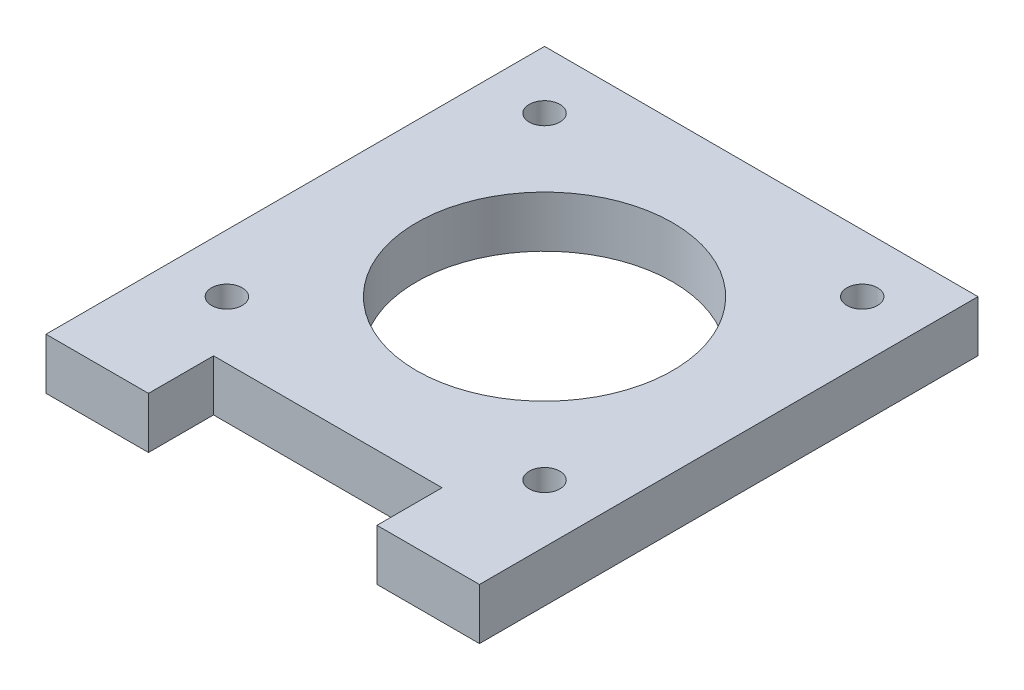
ISO-10303-21;
HEADER;
FILE_DESCRIPTION(('STEP AP214'),'2;1');
FILE_NAME('part.step','',(''),(''),'','','');
FILE_SCHEMA(('AUTOMOTIVE_DESIGN { 1 0 10303 214 1 1 1 1 }'));
ENDSEC;
DATA;
#1=APPLICATION_CONTEXT('core data for automotive mechanical design processes');
#2=APPLICATION_PROTOCOL_DEFINITION('international standard','automotive_design',2000,#1);
#3=PRODUCT_CONTEXT('',#1,'mechanical');
#4=PRODUCT('Part','Part','',(#3));
#5=PRODUCT_RELATED_PRODUCT_CATEGORY('part','',(#4));
#6=PRODUCT_DEFINITION_FORMATION('','',#4);
#7=PRODUCT_DEFINITION_CONTEXT('part definition',#1,'design');
#8=PRODUCT_DEFINITION('design','',#6,#7);
#9=PRODUCT_DEFINITION_SHAPE('','',#8);
#10=(LENGTH_UNIT() NAMED_UNIT(*) SI_UNIT(.MILLI.,.METRE.));
#11=(NAMED_UNIT(*) PLANE_ANGLE_UNIT() SI_UNIT($,.RADIAN.));
#12=(NAMED_UNIT(*) SI_UNIT($,.STERADIAN.) SOLID_ANGLE_UNIT());
#13=UNCERTAINTY_MEASURE_WITH_UNIT(LENGTH_MEASURE(1.E-05),#10,'distance_accuracy_value','');
#14=(GEOMETRIC_REPRESENTATION_CONTEXT(3) GLOBAL_UNCERTAINTY_ASSIGNED_CONTEXT((#13)) GLOBAL_UNIT_ASSIGNED_CONTEXT((#10,
#11,#12)) REPRESENTATION_CONTEXT('',''));
#15=CARTESIAN_POINT('',(0.,0.,0.));
#16=DIRECTION('',(0.,0.,1.));
#17=DIRECTION('',(1.,0.,0.));
#18=AXIS2_PLACEMENT_3D('',#15,#16,#17);
#19=CARTESIAN_POINT('',(0.,2.5,0.));
#20=DIRECTION('',(0.,-1.,0.));
#21=DIRECTION('',(0.,0.,-1.));
#22=AXIS2_PLACEMENT_3D('',#19,#20,#21);
#23=PLANE('',#22);
#24=DIRECTION('',(0.,0.,-1.));
#25=VECTOR('',#24,1.);
#26=CARTESIAN_POINT('',(21.15,2.5,21.15));
#27=LINE('',#26,#25);
#28=CARTESIAN_POINT('',(21.15,2.5,27.5));
#29=VERTEX_POINT('',#28);
#30=CARTESIAN_POINT('',(21.15,2.5,-21.15));
#31=VERTEX_POINT('',#30);
#32=EDGE_CURVE('E50',#29,#31,#27,.T.);
#33=ORIENTED_EDGE('',*,*,#32,.T.);
#34=DIRECTION('',(-1.,0.,0.));
#35=VECTOR('',#34,1.);
#36=CARTESIAN_POINT('',(-21.15,2.5,-21.15));
#37=LINE('',#36,#35);
#38=CARTESIAN_POINT('',(-21.15,2.5,-21.15));
#39=VERTEX_POINT('',#38);
#40=EDGE_CURVE('E94',#31,#39,#37,.T.);
#41=ORIENTED_EDGE('',*,*,#40,.T.);
#42=DIRECTION('',(0.,0.,1.));
#43=VECTOR('',#42,1.);
#44=CARTESIAN_POINT('',(-21.15,2.5,21.15));
#45=LINE('',#44,#43);
#46=CARTESIAN_POINT('',(-21.15,2.5,27.5));
#47=VERTEX_POINT('',#46);
#48=EDGE_CURVE('E162',#39,#47,#45,.T.);
#49=ORIENTED_EDGE('',*,*,#48,.T.);
#50=DIRECTION('',(1.,0.,0.));
#51=VECTOR('',#50,1.);
#52=CARTESIAN_POINT('',(-21.15,2.5,27.5));
#53=LINE('',#52,#51);
#54=CARTESIAN_POINT('',(-11.15,2.5,27.5));
#55=VERTEX_POINT('',#54);
#56=EDGE_CURVE('E176',#47,#55,#53,.T.);
#57=ORIENTED_EDGE('',*,*,#56,.T.);
#58=DIRECTION('',(0.,0.,-1.));
#59=VECTOR('',#58,1.);
#60=CARTESIAN_POINT('',(-11.15,2.5,27.5));
#61=LINE('',#60,#59);
#62=CARTESIAN_POINT('',(-11.15,2.5,21.15));
#63=VERTEX_POINT('',#62);
#64=EDGE_CURVE('E114',#55,#63,#61,.T.);
#65=ORIENTED_EDGE('',*,*,#64,.T.);
#66=DIRECTION('',(1.,0.,0.));
#67=VECTOR('',#66,1.);
#68=CARTESIAN_POINT('',(-11.15,2.5,21.15));
#69=LINE('',#68,#67);
#70=CARTESIAN_POINT('',(11.15,2.5,21.15));
#71=VERTEX_POINT('',#70);
#72=EDGE_CURVE('E108',#63,#71,#69,.T.);
#73=ORIENTED_EDGE('',*,*,#72,.T.);
#74=DIRECTION('',(0.,0.,1.));
#75=VECTOR('',#74,1.);
#76=CARTESIAN_POINT('',(11.15,2.5,21.15));
#77=LINE('',#76,#75);
#78=CARTESIAN_POINT('',(11.15,2.5,27.5));
#79=VERTEX_POINT('',#78);
#80=EDGE_CURVE('E112',#71,#79,#77,.T.);
#81=ORIENTED_EDGE('',*,*,#80,.T.);
#82=DIRECTION('',(1.,0.,0.));
#83=VECTOR('',#82,1.);
#84=CARTESIAN_POINT('',(11.15,2.5,27.5));
#85=LINE('',#84,#83);
#86=EDGE_CURVE('E128',#79,#29,#85,.T.);
#87=ORIENTED_EDGE('',*,*,#86,.T.);
#88=EDGE_LOOP('',(#33,#41,#49,#57,#65,#73,#81,#87));
#89=FACE_BOUND('',#88,.T.);
#90=CARTESIAN_POINT('',(0.,2.5,0.));
#91=DIRECTION('',(0.,1.,0.));
#92=DIRECTION('',(0.,0.,1.));
#93=AXIS2_PLACEMENT_3D('',#90,#91,#92);
#94=CIRCLE('',#93,12.5);
#95=CARTESIAN_POINT('',(0.,2.5,12.5));
#96=VERTEX_POINT('',#95);
#97=EDGE_CURVE('E138',#96,#96,#94,.T.);
#98=ORIENTED_EDGE('',*,*,#97,.F.);
#99=EDGE_LOOP('',(#98));
#100=FACE_BOUND('',#99,.T.);
#101=CARTESIAN_POINT('',(-15.5,2.5,-15.5));
#102=DIRECTION('',(0.,1.,0.));
#103=DIRECTION('',(0.,0.,1.));
#104=AXIS2_PLACEMENT_3D('',#101,#102,#103);
#105=CIRCLE('',#104,1.5);
#106=CARTESIAN_POINT('',(-15.5,2.5,-14.));
#107=VERTEX_POINT('',#106);
#108=EDGE_CURVE('E185',#107,#107,#105,.T.);
#109=ORIENTED_EDGE('',*,*,#108,.F.);
#110=EDGE_LOOP('',(#109));
#111=FACE_BOUND('',#110,.T.);
#112=CARTESIAN_POINT('',(15.5,2.5,-15.5));
#113=DIRECTION('',(0.,1.,0.));
#114=DIRECTION('',(0.,0.,1.));
#115=AXIS2_PLACEMENT_3D('',#112,#113,#114);
#116=CIRCLE('',#115,1.5);
#117=CARTESIAN_POINT('',(15.5,2.5,-14.));
#118=VERTEX_POINT('',#117);
#119=EDGE_CURVE('E191',#118,#118,#116,.T.);
#120=ORIENTED_EDGE('',*,*,#119,.F.);
#121=EDGE_LOOP('',(#120));
#122=FACE_BOUND('',#121,.T.);
#123=CARTESIAN_POINT('',(15.5,2.5,15.5));
#124=DIRECTION('',(0.,1.,0.));
#125=DIRECTION('',(0.,0.,1.));
#126=AXIS2_PLACEMENT_3D('',#123,#124,#125);
#127=CIRCLE('',#126,1.5);
#128=CARTESIAN_POINT('',(15.5,2.5,17.));
#129=VERTEX_POINT('',#128);
#130=EDGE_CURVE('E197',#129,#129,#127,.T.);
#131=ORIENTED_EDGE('',*,*,#130,.F.);
#132=EDGE_LOOP('',(#131));
#133=FACE_BOUND('',#132,.T.);
#134=CARTESIAN_POINT('',(-15.5,2.5,15.5));
#135=DIRECTION('',(0.,1.,0.));
#136=DIRECTION('',(0.,0.,1.));
#137=AXIS2_PLACEMENT_3D('',#134,#135,#136);
#138=CIRCLE('',#137,1.5);
#139=CARTESIAN_POINT('',(-15.5,2.5,17.));
#140=VERTEX_POINT('',#139);
#141=EDGE_CURVE('E203',#140,#140,#138,.T.);
#142=ORIENTED_EDGE('',*,*,#141,.F.);
#143=EDGE_LOOP('',(#142));
#144=FACE_BOUND('',#143,.T.);
#145=ADVANCED_FACE('F33',(#89,#100,#111,#122,#133,#144),#23,.F.);
#146=CARTESIAN_POINT('',(0.,-2.5,0.));
#147=DIRECTION('',(0.,-1.,0.));
#148=DIRECTION('',(0.,0.,-1.));
#149=AXIS2_PLACEMENT_3D('',#146,#147,#148);
#150=PLANE('',#149);
#151=CARTESIAN_POINT('',(15.5,-2.5,15.5));
#152=DIRECTION('',(0.,1.,0.));
#153=DIRECTION('',(0.,0.,1.));
#154=AXIS2_PLACEMENT_3D('',#151,#152,#153);
#155=CIRCLE('',#154,1.5);
#156=CARTESIAN_POINT('',(15.5,-2.5,17.));
#157=VERTEX_POINT('',#156);
#158=EDGE_CURVE('E200',#157,#157,#155,.T.);
#159=ORIENTED_EDGE('',*,*,#158,.T.);
#160=EDGE_LOOP('',(#159));
#161=FACE_BOUND('',#160,.T.);
#162=CARTESIAN_POINT('',(-15.5,-2.5,-15.5));
#163=DIRECTION('',(0.,1.,0.));
#164=DIRECTION('',(0.,0.,1.));
#165=AXIS2_PLACEMENT_3D('',#162,#163,#164);
#166=CIRCLE('',#165,1.5);
#167=CARTESIAN_POINT('',(-15.5,-2.5,-14.));
#168=VERTEX_POINT('',#167);
#169=EDGE_CURVE('E188',#168,#168,#166,.T.);
#170=ORIENTED_EDGE('',*,*,#169,.T.);
#171=EDGE_LOOP('',(#170));
#172=FACE_BOUND('',#171,.T.);
#173=DIRECTION('',(-1.,0.,0.));
#174=VECTOR('',#173,1.);
#175=CARTESIAN_POINT('',(-21.15,-2.5,-21.15));
#176=LINE('',#175,#174);
#177=CARTESIAN_POINT('',(21.15,-2.5,-21.15));
#178=VERTEX_POINT('',#177);
#179=CARTESIAN_POINT('',(-21.15,-2.5,-21.15));
#180=VERTEX_POINT('',#179);
#181=EDGE_CURVE('E134',#178,#180,#176,.T.);
#182=ORIENTED_EDGE('',*,*,#181,.F.);
#183=DIRECTION('',(0.,0.,-1.));
#184=VECTOR('',#183,1.);
#185=CARTESIAN_POINT('',(21.15,-2.5,27.5));
#186=LINE('',#185,#184);
#187=CARTESIAN_POINT('',(21.15,-2.5,27.5));
#188=VERTEX_POINT('',#187);
#189=EDGE_CURVE('E147',#188,#178,#186,.T.);
#190=ORIENTED_EDGE('',*,*,#189,.F.);
#191=DIRECTION('',(1.,0.,0.));
#192=VECTOR('',#191,1.);
#193=CARTESIAN_POINT('',(11.15,-2.5,27.5));
#194=LINE('',#193,#192);
#195=CARTESIAN_POINT('',(11.15,-2.5,27.5));
#196=VERTEX_POINT('',#195);
#197=EDGE_CURVE('E87',#196,#188,#194,.T.);
#198=ORIENTED_EDGE('',*,*,#197,.F.);
#199=DIRECTION('',(0.,0.,1.));
#200=VECTOR('',#199,1.);
#201=CARTESIAN_POINT('',(11.15,-2.5,21.15));
#202=LINE('',#201,#200);
#203=CARTESIAN_POINT('',(11.15,-2.5,21.15));
#204=VERTEX_POINT('',#203);
#205=EDGE_CURVE('E80',#204,#196,#202,.T.);
#206=ORIENTED_EDGE('',*,*,#205,.F.);
#207=DIRECTION('',(1.,0.,0.));
#208=VECTOR('',#207,1.);
#209=CARTESIAN_POINT('',(-11.15,-2.5,21.15));
#210=LINE('',#209,#208);
#211=CARTESIAN_POINT('',(-11.15,-2.5,21.15));
#212=VERTEX_POINT('',#211);
#213=EDGE_CURVE('E122',#212,#204,#210,.T.);
#214=ORIENTED_EDGE('',*,*,#213,.F.);
#215=DIRECTION('',(0.,0.,-1.));
#216=VECTOR('',#215,1.);
#217=CARTESIAN_POINT('',(-11.15,-2.5,27.5));
#218=LINE('',#217,#216);
#219=CARTESIAN_POINT('',(-11.15,-2.5,27.5));
#220=VERTEX_POINT('',#219);
#221=EDGE_CURVE('E142',#220,#212,#218,.T.);
#222=ORIENTED_EDGE('',*,*,#221,.F.);
#223=DIRECTION('',(1.,0.,0.));
#224=VECTOR('',#223,1.);
#225=CARTESIAN_POINT('',(-21.15,-2.5,27.5));
#226=LINE('',#225,#224);
#227=CARTESIAN_POINT('',(-21.15,-2.5,27.5));
#228=VERTEX_POINT('',#227);
#229=EDGE_CURVE('E140',#228,#220,#226,.T.);
#230=ORIENTED_EDGE('',*,*,#229,.F.);
#231=DIRECTION('',(0.,0.,1.));
#232=VECTOR('',#231,1.);
#233=CARTESIAN_POINT('',(-21.15,-2.5,21.15));
#234=LINE('',#233,#232);
#235=EDGE_CURVE('E137',#180,#228,#234,.T.);
#236=ORIENTED_EDGE('',*,*,#235,.F.);
#237=EDGE_LOOP('',(#182,#190,#198,#206,#214,#222,#230,#236));
#238=FACE_BOUND('',#237,.T.);
#239=CARTESIAN_POINT('',(0.,-2.5,0.));
#240=DIRECTION('',(0.,1.,0.));
#241=DIRECTION('',(0.,0.,1.));
#242=AXIS2_PLACEMENT_3D('',#239,#240,#241);
#243=CIRCLE('',#242,12.5);
#244=CARTESIAN_POINT('',(0.,-2.5,12.5));
#245=VERTEX_POINT('',#244);
#246=EDGE_CURVE('E182',#245,#245,#243,.T.);
#247=ORIENTED_EDGE('',*,*,#246,.T.);
#248=EDGE_LOOP('',(#247));
#249=FACE_BOUND('',#248,.T.);
#250=CARTESIAN_POINT('',(15.5,-2.5,-15.5));
#251=DIRECTION('',(0.,1.,0.));
#252=DIRECTION('',(0.,0.,1.));
#253=AXIS2_PLACEMENT_3D('',#250,#251,#252);
#254=CIRCLE('',#253,1.5);
#255=CARTESIAN_POINT('',(15.5,-2.5,-14.));
#256=VERTEX_POINT('',#255);
#257=EDGE_CURVE('E194',#256,#256,#254,.T.);
#258=ORIENTED_EDGE('',*,*,#257,.T.);
#259=EDGE_LOOP('',(#258));
#260=FACE_BOUND('',#259,.T.);
#261=CARTESIAN_POINT('',(-15.5,-2.5,15.5));
#262=DIRECTION('',(0.,1.,0.));
#263=DIRECTION('',(0.,0.,1.));
#264=AXIS2_PLACEMENT_3D('',#261,#262,#263);
#265=CIRCLE('',#264,1.5);
#266=CARTESIAN_POINT('',(-15.5,-2.5,17.));
#267=VERTEX_POINT('',#266);
#268=EDGE_CURVE('E206',#267,#267,#265,.T.);
#269=ORIENTED_EDGE('',*,*,#268,.T.);
#270=EDGE_LOOP('',(#269));
#271=FACE_BOUND('',#270,.T.);
#272=ADVANCED_FACE('F166',(#161,#172,#238,#249,#260,#271),#150,.T.);
#273=CARTESIAN_POINT('',(-21.15,2.5,-21.15));
#274=DIRECTION('',(0.,0.,1.));
#275=DIRECTION('',(1.,0.,0.));
#276=AXIS2_PLACEMENT_3D('',#273,#274,#275);
#277=PLANE('',#276);
#278=ORIENTED_EDGE('',*,*,#181,.T.);
#279=DIRECTION('',(0.,-1.,0.));
#280=VECTOR('',#279,1.);
#281=CARTESIAN_POINT('',(-21.15,2.5,-21.15));
#282=LINE('',#281,#280);
#283=EDGE_CURVE('E42',#39,#180,#282,.T.);
#284=ORIENTED_EDGE('',*,*,#283,.F.);
#285=ORIENTED_EDGE('',*,*,#40,.F.);
#286=DIRECTION('',(0.,-1.,0.));
#287=VECTOR('',#286,1.);
#288=CARTESIAN_POINT('',(21.15,2.5,-21.15));
#289=LINE('',#288,#287);
#290=EDGE_CURVE('E11',#31,#178,#289,.T.);
#291=ORIENTED_EDGE('',*,*,#290,.T.);
#292=EDGE_LOOP('',(#278,#284,#285,#291));
#293=FACE_BOUND('',#292,.T.);
#294=ADVANCED_FACE('F35',(#293),#277,.F.);
#295=CARTESIAN_POINT('',(-21.15,2.5,21.15));
#296=DIRECTION('',(1.,0.,0.));
#297=DIRECTION('',(0.,0.,-1.));
#298=AXIS2_PLACEMENT_3D('',#295,#296,#297);
#299=PLANE('',#298);
#300=ORIENTED_EDGE('',*,*,#235,.T.);
#301=DIRECTION('',(0.,-1.,0.));
#302=VECTOR('',#301,1.);
#303=CARTESIAN_POINT('',(-21.15,2.5,27.5));
#304=LINE('',#303,#302);
#305=EDGE_CURVE('E155',#47,#228,#304,.T.);
#306=ORIENTED_EDGE('',*,*,#305,.F.);
#307=ORIENTED_EDGE('',*,*,#48,.F.);
#308=ORIENTED_EDGE('',*,*,#283,.T.);
#309=EDGE_LOOP('',(#300,#306,#307,#308));
#310=FACE_BOUND('',#309,.T.);
#311=ADVANCED_FACE('F160',(#310),#299,.F.);
#312=CARTESIAN_POINT('',(-21.15,2.5,27.5));
#313=DIRECTION('',(0.,0.,-1.));
#314=DIRECTION('',(-1.,0.,0.));
#315=AXIS2_PLACEMENT_3D('',#312,#313,#314);
#316=PLANE('',#315);
#317=ORIENTED_EDGE('',*,*,#229,.T.);
#318=DIRECTION('',(0.,-1.,0.));
#319=VECTOR('',#318,1.);
#320=CARTESIAN_POINT('',(-11.15,2.5,27.5));
#321=LINE('',#320,#319);
#322=EDGE_CURVE('E152',#55,#220,#321,.T.);
#323=ORIENTED_EDGE('',*,*,#322,.F.);
#324=ORIENTED_EDGE('',*,*,#56,.F.);
#325=ORIENTED_EDGE('',*,*,#305,.T.);
#326=EDGE_LOOP('',(#317,#323,#324,#325));
#327=FACE_BOUND('',#326,.T.);
#328=ADVANCED_FACE('F172',(#327),#316,.F.);
#329=CARTESIAN_POINT('',(-11.15,2.5,27.5));
#330=DIRECTION('',(-1.,0.,0.));
#331=DIRECTION('',(0.,0.,1.));
#332=AXIS2_PLACEMENT_3D('',#329,#330,#331);
#333=PLANE('',#332);
#334=ORIENTED_EDGE('',*,*,#221,.T.);
#335=DIRECTION('',(0.,-1.,0.));
#336=VECTOR('',#335,1.);
#337=CARTESIAN_POINT('',(-11.15,2.5,21.15));
#338=LINE('',#337,#336);
#339=EDGE_CURVE('E123',#63,#212,#338,.T.);
#340=ORIENTED_EDGE('',*,*,#339,.F.);
#341=ORIENTED_EDGE('',*,*,#64,.F.);
#342=ORIENTED_EDGE('',*,*,#322,.T.);
#343=EDGE_LOOP('',(#334,#340,#341,#342));
#344=FACE_BOUND('',#343,.T.);
#345=ADVANCED_FACE('F175',(#344),#333,.F.);
#346=CARTESIAN_POINT('',(-11.15,2.5,21.15));
#347=DIRECTION('',(0.,0.,-1.));
#348=DIRECTION('',(-1.,0.,0.));
#349=AXIS2_PLACEMENT_3D('',#346,#347,#348);
#350=PLANE('',#349);
#351=ORIENTED_EDGE('',*,*,#213,.T.);
#352=DIRECTION('',(0.,-1.,0.));
#353=VECTOR('',#352,1.);
#354=CARTESIAN_POINT('',(11.15,2.5,21.15));
#355=LINE('',#354,#353);
#356=EDGE_CURVE('E119',#71,#204,#355,.T.);
#357=ORIENTED_EDGE('',*,*,#356,.F.);
#358=ORIENTED_EDGE('',*,*,#72,.F.);
#359=ORIENTED_EDGE('',*,*,#339,.T.);
#360=EDGE_LOOP('',(#351,#357,#358,#359));
#361=FACE_BOUND('',#360,.T.);
#362=ADVANCED_FACE('F120',(#361),#350,.F.);
#363=CARTESIAN_POINT('',(11.15,2.5,21.15));
#364=DIRECTION('',(1.,0.,0.));
#365=DIRECTION('',(0.,0.,-1.));
#366=AXIS2_PLACEMENT_3D('',#363,#364,#365);
#367=PLANE('',#366);
#368=ORIENTED_EDGE('',*,*,#205,.T.);
#369=DIRECTION('',(0.,-1.,0.));
#370=VECTOR('',#369,1.);
#371=CARTESIAN_POINT('',(11.15,2.5,27.5));
#372=LINE('',#371,#370);
#373=EDGE_CURVE('E124',#79,#196,#372,.T.);
#374=ORIENTED_EDGE('',*,*,#373,.F.);
#375=ORIENTED_EDGE('',*,*,#80,.F.);
#376=ORIENTED_EDGE('',*,*,#356,.T.);
#377=EDGE_LOOP('',(#368,#374,#375,#376));
#378=FACE_BOUND('',#377,.T.);
#379=ADVANCED_FACE('F126',(#378),#367,.F.);
#380=CARTESIAN_POINT('',(11.15,2.5,27.5));
#381=DIRECTION('',(0.,0.,-1.));
#382=DIRECTION('',(-1.,0.,0.));
#383=AXIS2_PLACEMENT_3D('',#380,#381,#382);
#384=PLANE('',#383);
#385=ORIENTED_EDGE('',*,*,#197,.T.);
#386=DIRECTION('',(0.,-1.,0.));
#387=VECTOR('',#386,1.);
#388=CARTESIAN_POINT('',(21.15,2.5,27.5));
#389=LINE('',#388,#387);
#390=EDGE_CURVE('E130',#29,#188,#389,.T.);
#391=ORIENTED_EDGE('',*,*,#390,.F.);
#392=ORIENTED_EDGE('',*,*,#86,.F.);
#393=ORIENTED_EDGE('',*,*,#373,.T.);
#394=EDGE_LOOP('',(#385,#391,#392,#393));
#395=FACE_BOUND('',#394,.T.);
#396=ADVANCED_FACE('F229',(#395),#384,.F.);
#397=CARTESIAN_POINT('',(21.15,2.5,27.5));
#398=DIRECTION('',(-1.,0.,0.));
#399=DIRECTION('',(0.,0.,1.));
#400=AXIS2_PLACEMENT_3D('',#397,#398,#399);
#401=PLANE('',#400);
#402=ORIENTED_EDGE('',*,*,#189,.T.);
#403=ORIENTED_EDGE('',*,*,#290,.F.);
#404=ORIENTED_EDGE('',*,*,#32,.F.);
#405=ORIENTED_EDGE('',*,*,#390,.T.);
#406=EDGE_LOOP('',(#402,#403,#404,#405));
#407=FACE_BOUND('',#406,.T.);
#408=ADVANCED_FACE('F226',(#407),#401,.F.);
#409=CARTESIAN_POINT('',(0.,2.5,0.));
#410=DIRECTION('',(0.,-1.,0.));
#411=DIRECTION('',(0.,0.,-1.));
#412=AXIS2_PLACEMENT_3D('',#409,#410,#411);
#413=CYLINDRICAL_SURFACE('',#412,12.5);
#414=ORIENTED_EDGE('',*,*,#97,.T.);
#415=EDGE_LOOP('',(#414));
#416=FACE_BOUND('',#415,.T.);
#417=ORIENTED_EDGE('',*,*,#246,.F.);
#418=EDGE_LOOP('',(#417));
#419=FACE_BOUND('',#418,.T.);
#420=ADVANCED_FACE('F223',(#416,#419),#413,.F.);
#421=CARTESIAN_POINT('',(-15.5,2.5,-15.5));
#422=DIRECTION('',(0.,-1.,0.));
#423=DIRECTION('',(0.,0.,-1.));
#424=AXIS2_PLACEMENT_3D('',#421,#422,#423);
#425=CYLINDRICAL_SURFACE('',#424,1.5);
#426=ORIENTED_EDGE('',*,*,#108,.T.);
#427=EDGE_LOOP('',(#426));
#428=FACE_BOUND('',#427,.T.);
#429=ORIENTED_EDGE('',*,*,#169,.F.);
#430=EDGE_LOOP('',(#429));
#431=FACE_BOUND('',#430,.T.);
#432=ADVANCED_FACE('F305',(#428,#431),#425,.F.);
#433=CARTESIAN_POINT('',(15.5,2.5,-15.5));
#434=DIRECTION('',(0.,-1.,0.));
#435=DIRECTION('',(0.,0.,-1.));
#436=AXIS2_PLACEMENT_3D('',#433,#434,#435);
#437=CYLINDRICAL_SURFACE('',#436,1.5);
#438=ORIENTED_EDGE('',*,*,#119,.T.);
#439=EDGE_LOOP('',(#438));
#440=FACE_BOUND('',#439,.T.);
#441=ORIENTED_EDGE('',*,*,#257,.F.);
#442=EDGE_LOOP('',(#441));
#443=FACE_BOUND('',#442,.T.);
#444=ADVANCED_FACE('F313',(#440,#443),#437,.F.);
#445=CARTESIAN_POINT('',(15.5,2.5,15.5));
#446=DIRECTION('',(0.,-1.,0.));
#447=DIRECTION('',(0.,0.,-1.));
#448=AXIS2_PLACEMENT_3D('',#445,#446,#447);
#449=CYLINDRICAL_SURFACE('',#448,1.5);
#450=ORIENTED_EDGE('',*,*,#130,.T.);
#451=EDGE_LOOP('',(#450));
#452=FACE_BOUND('',#451,.T.);
#453=ORIENTED_EDGE('',*,*,#158,.F.);
#454=EDGE_LOOP('',(#453));
#455=FACE_BOUND('',#454,.T.);
#456=ADVANCED_FACE('F321',(#452,#455),#449,.F.);
#457=CARTESIAN_POINT('',(-15.5,2.5,15.5));
#458=DIRECTION('',(0.,-1.,0.));
#459=DIRECTION('',(0.,0.,-1.));
#460=AXIS2_PLACEMENT_3D('',#457,#458,#459);
#461=CYLINDRICAL_SURFACE('',#460,1.5);
#462=ORIENTED_EDGE('',*,*,#141,.T.);
#463=EDGE_LOOP('',(#462));
#464=FACE_BOUND('',#463,.T.);
#465=ORIENTED_EDGE('',*,*,#268,.F.);
#466=EDGE_LOOP('',(#465));
#467=FACE_BOUND('',#466,.T.);
#468=ADVANCED_FACE('F212',(#464,#467),#461,.F.);
#469=CLOSED_SHELL('',(#145,#272,#294,#311,#328,#345,#362,#379,#396,#408,#420,#432,#444,#456,#468));
#470=MANIFOLD_SOLID_BREP('B2',#469);
#471=ADVANCED_BREP_SHAPE_REPRESENTATION('',(#18,#470),#14);
#472=SHAPE_DEFINITION_REPRESENTATION(#9,#471);
ENDSEC;
END-ISO-10303-21;
